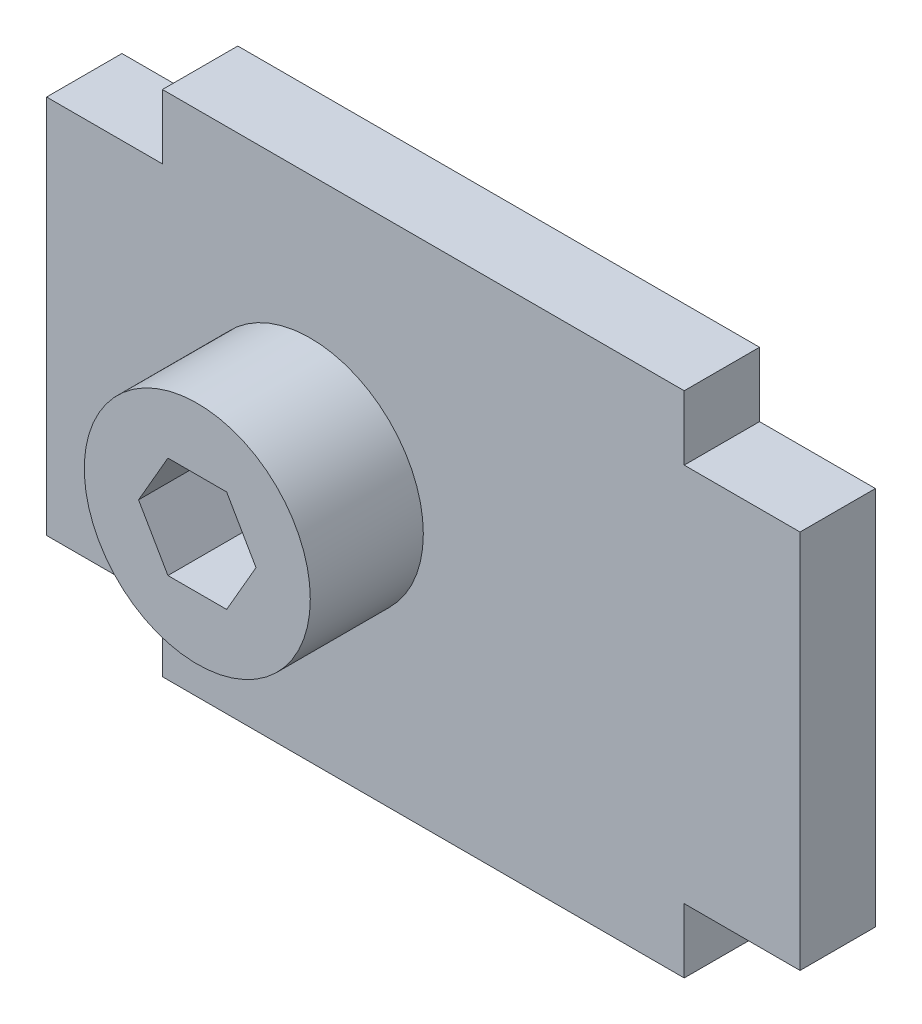
ISO-10303-21;
HEADER;
FILE_DESCRIPTION(('STEP AP214'),'2;1');
FILE_NAME('part.step','',(''),(''),'','','');
FILE_SCHEMA(('AUTOMOTIVE_DESIGN { 1 0 10303 214 1 1 1 1 }'));
ENDSEC;
DATA;
#1=APPLICATION_CONTEXT('core data for automotive mechanical design processes');
#2=APPLICATION_PROTOCOL_DEFINITION('international standard','automotive_design',2000,#1);
#3=PRODUCT_CONTEXT('',#1,'mechanical');
#4=PRODUCT('Part','Part','',(#3));
#5=PRODUCT_RELATED_PRODUCT_CATEGORY('part','',(#4));
#6=PRODUCT_DEFINITION_FORMATION('','',#4);
#7=PRODUCT_DEFINITION_CONTEXT('part definition',#1,'design');
#8=PRODUCT_DEFINITION('design','',#6,#7);
#9=PRODUCT_DEFINITION_SHAPE('','',#8);
#10=(LENGTH_UNIT() NAMED_UNIT(*) SI_UNIT(.MILLI.,.METRE.));
#11=(NAMED_UNIT(*) PLANE_ANGLE_UNIT() SI_UNIT($,.RADIAN.));
#12=(NAMED_UNIT(*) SI_UNIT($,.STERADIAN.) SOLID_ANGLE_UNIT());
#13=UNCERTAINTY_MEASURE_WITH_UNIT(LENGTH_MEASURE(1.E-05),#10,'distance_accuracy_value','');
#14=(GEOMETRIC_REPRESENTATION_CONTEXT(3) GLOBAL_UNCERTAINTY_ASSIGNED_CONTEXT((#13)) GLOBAL_UNIT_ASSIGNED_CONTEXT((#10,
#11,#12)) REPRESENTATION_CONTEXT('',''));
#15=CARTESIAN_POINT('',(0.,0.,0.));
#16=DIRECTION('',(0.,0.,1.));
#17=DIRECTION('',(1.,0.,0.));
#18=AXIS2_PLACEMENT_3D('',#15,#16,#17);
#19=CARTESIAN_POINT('',(0.,0.,4.));
#20=DIRECTION('',(0.,0.,1.));
#21=DIRECTION('',(1.,0.,0.));
#22=AXIS2_PLACEMENT_3D('',#19,#20,#21);
#23=PLANE('',#22);
#24=CARTESIAN_POINT('',(32.4130973656436,-20.4285217908088,4.));
#25=DIRECTION('',(0.,0.,1.));
#26=DIRECTION('',(1.,0.,0.));
#27=AXIS2_PLACEMENT_3D('',#24,#25,#26);
#28=CIRCLE('',#27,1.6);
#29=CARTESIAN_POINT('',(34.0130973656436,-20.4285217908088,4.));
#30=VERTEX_POINT('',#29);
#31=EDGE_CURVE('E170',#30,#30,#28,.T.);
#32=ORIENTED_EDGE('',*,*,#31,.F.);
#33=EDGE_LOOP('',(#32));
#34=FACE_BOUND('',#33,.T.);
#35=DIRECTION('',(0.5,0.866025403784438,0.));
#36=VECTOR('',#35,1.);
#37=CARTESIAN_POINT('',(35.4939010307529,-20.4924133146951,4.));
#38=LINE('',#37,#36);
#39=CARTESIAN_POINT('',(33.9719430924556,-23.1285217908088,4.));
#40=VERTEX_POINT('',#39);
#41=CARTESIAN_POINT('',(35.5307888192676,-20.4285217908088,4.));
#42=VERTEX_POINT('',#41);
#43=EDGE_CURVE('E167',#40,#42,#38,.T.);
#44=ORIENTED_EDGE('',*,*,#43,.T.);
#45=DIRECTION('',(-0.499999999999999,0.866025403784439,0.));
#46=VECTOR('',#45,1.);
#47=CARTESIAN_POINT('',(17.8022821981485,10.2781524192907,4.));
#48=LINE('',#47,#46);
#49=CARTESIAN_POINT('',(33.9719430924556,-17.7285217908088,4.));
#50=VERTEX_POINT('',#49);
#51=EDGE_CURVE('E208',#42,#50,#48,.T.);
#52=ORIENTED_EDGE('',*,*,#51,.T.);
#53=DIRECTION('',(-1.,0.,0.));
#54=VECTOR('',#53,1.);
#55=CARTESIAN_POINT('',(0.,-17.7285217908088,4.));
#56=LINE('',#55,#54);
#57=CARTESIAN_POINT('',(30.8542516388316,-17.7285217908088,4.));
#58=VERTEX_POINT('',#57);
#59=EDGE_CURVE('E206',#50,#58,#56,.T.);
#60=ORIENTED_EDGE('',*,*,#59,.T.);
#61=DIRECTION('',(-0.499999999999999,-0.866025403784439,0.));
#62=VECTOR('',#61,1.);
#63=CARTESIAN_POINT('',(30.8173638503169,-17.7924133146951,4.));
#64=LINE('',#63,#62);
#65=CARTESIAN_POINT('',(29.2954059120196,-20.4285217908088,4.));
#66=VERTEX_POINT('',#65);
#67=EDGE_CURVE('E204',#58,#66,#64,.T.);
#68=ORIENTED_EDGE('',*,*,#67,.T.);
#69=DIRECTION('',(0.5,-0.866025403784439,0.));
#70=VECTOR('',#69,1.);
#71=CARTESIAN_POINT('',(13.1257450177125,7.57815241929071,4.));
#72=LINE('',#71,#70);
#73=CARTESIAN_POINT('',(30.8542516388316,-23.1285217908088,4.));
#74=VERTEX_POINT('',#73);
#75=EDGE_CURVE('E57',#66,#74,#72,.T.);
#76=ORIENTED_EDGE('',*,*,#75,.T.);
#77=DIRECTION('',(1.,0.,0.));
#78=VECTOR('',#77,1.);
#79=CARTESIAN_POINT('',(0.,-23.1285217908088,4.));
#80=LINE('',#79,#78);
#81=EDGE_CURVE('E52',#74,#40,#80,.T.);
#82=ORIENTED_EDGE('',*,*,#81,.T.);
#83=EDGE_LOOP('',(#44,#52,#60,#68,#76,#82));
#84=FACE_BOUND('',#83,.T.);
#85=ADVANCED_FACE('F37',(#34,#84),#23,.T.);
#86=CARTESIAN_POINT('',(52.2630973656438,-6.92852179080886,4.));
#87=DIRECTION('',(0.,-1.,0.));
#88=DIRECTION('',(1.,0.,0.));
#89=AXIS2_PLACEMENT_3D('',#86,#87,#88);
#90=PLANE('',#89);
#91=DIRECTION('',(-1.,0.,0.));
#92=VECTOR('',#91,1.);
#93=CARTESIAN_POINT('',(52.2630973656438,-6.92852179080886,0.));
#94=LINE('',#93,#92);
#95=CARTESIAN_POINT('',(52.2630973656438,-6.92852179080886,0.));
#96=VERTEX_POINT('',#95);
#97=CARTESIAN_POINT('',(24.5630973656438,-6.92852179080886,0.));
#98=VERTEX_POINT('',#97);
#99=EDGE_CURVE('E226',#96,#98,#94,.T.);
#100=ORIENTED_EDGE('',*,*,#99,.T.);
#101=DIRECTION('',(0.,0.,-1.));
#102=VECTOR('',#101,1.);
#103=CARTESIAN_POINT('',(24.5630973656438,-6.92852179080886,4.));
#104=LINE('',#103,#102);
#105=CARTESIAN_POINT('',(24.5630973656438,-6.92852179080886,4.));
#106=VERTEX_POINT('',#105);
#107=EDGE_CURVE('E11',#106,#98,#104,.T.);
#108=ORIENTED_EDGE('',*,*,#107,.F.);
#109=DIRECTION('',(-1.,0.,0.));
#110=VECTOR('',#109,1.);
#111=CARTESIAN_POINT('',(52.2630973656438,-6.92852179080886,4.));
#112=LINE('',#111,#110);
#113=CARTESIAN_POINT('',(52.2630973656438,-6.92852179080886,4.));
#114=VERTEX_POINT('',#113);
#115=EDGE_CURVE('E229',#114,#106,#112,.T.);
#116=ORIENTED_EDGE('',*,*,#115,.F.);
#117=DIRECTION('',(0.,0.,-1.));
#118=VECTOR('',#117,1.);
#119=CARTESIAN_POINT('',(52.2630973656438,-6.92852179080886,4.));
#120=LINE('',#119,#118);
#121=EDGE_CURVE('E255',#114,#96,#120,.T.);
#122=ORIENTED_EDGE('',*,*,#121,.T.);
#123=EDGE_LOOP('',(#100,#108,#116,#122));
#124=FACE_BOUND('',#123,.T.);
#125=ADVANCED_FACE('F39',(#124),#90,.F.);
#126=CARTESIAN_POINT('',(24.5630973656438,-6.92852179080886,4.));
#127=DIRECTION('',(1.,0.,0.));
#128=DIRECTION('',(0.,0.,-1.));
#129=AXIS2_PLACEMENT_3D('',#126,#127,#128);
#130=PLANE('',#129);
#131=DIRECTION('',(0.,-1.,0.));
#132=VECTOR('',#131,1.);
#133=CARTESIAN_POINT('',(24.5630973656438,-6.92852179080886,0.));
#134=LINE('',#133,#132);
#135=CARTESIAN_POINT('',(24.5630973656438,-10.3485217908088,0.));
#136=VERTEX_POINT('',#135);
#137=EDGE_CURVE('E258',#98,#136,#134,.T.);
#138=ORIENTED_EDGE('',*,*,#137,.T.);
#139=DIRECTION('',(0.,0.,-1.));
#140=VECTOR('',#139,1.);
#141=CARTESIAN_POINT('',(24.5630973656438,-10.3485217908088,4.));
#142=LINE('',#141,#140);
#143=CARTESIAN_POINT('',(24.5630973656438,-10.3485217908088,4.));
#144=VERTEX_POINT('',#143);
#145=EDGE_CURVE('E45',#144,#136,#142,.T.);
#146=ORIENTED_EDGE('',*,*,#145,.F.);
#147=DIRECTION('',(0.,-1.,0.));
#148=VECTOR('',#147,1.);
#149=CARTESIAN_POINT('',(24.5630973656438,-6.92852179080886,4.));
#150=LINE('',#149,#148);
#151=EDGE_CURVE('E232',#106,#144,#150,.T.);
#152=ORIENTED_EDGE('',*,*,#151,.F.);
#153=ORIENTED_EDGE('',*,*,#107,.T.);
#154=EDGE_LOOP('',(#138,#146,#152,#153));
#155=FACE_BOUND('',#154,.T.);
#156=ADVANCED_FACE('F335',(#155),#130,.F.);
#157=CARTESIAN_POINT('',(24.5630973656438,-10.3485217908088,4.));
#158=DIRECTION('',(0.,-1.,0.));
#159=DIRECTION('',(1.,0.,0.));
#160=AXIS2_PLACEMENT_3D('',#157,#158,#159);
#161=PLANE('',#160);
#162=DIRECTION('',(-1.,0.,0.));
#163=VECTOR('',#162,1.);
#164=CARTESIAN_POINT('',(24.5630973656438,-10.3485217908088,0.));
#165=LINE('',#164,#163);
#166=CARTESIAN_POINT('',(18.4130973656438,-10.3485217908088,0.));
#167=VERTEX_POINT('',#166);
#168=EDGE_CURVE('E260',#136,#167,#165,.T.);
#169=ORIENTED_EDGE('',*,*,#168,.T.);
#170=DIRECTION('',(0.,0.,-1.));
#171=VECTOR('',#170,1.);
#172=CARTESIAN_POINT('',(18.4130973656438,-10.3485217908088,4.));
#173=LINE('',#172,#171);
#174=CARTESIAN_POINT('',(18.4130973656438,-10.3485217908088,4.));
#175=VERTEX_POINT('',#174);
#176=EDGE_CURVE('E305',#175,#167,#173,.T.);
#177=ORIENTED_EDGE('',*,*,#176,.F.);
#178=DIRECTION('',(-1.,0.,0.));
#179=VECTOR('',#178,1.);
#180=CARTESIAN_POINT('',(24.5630973656438,-10.3485217908088,4.));
#181=LINE('',#180,#179);
#182=EDGE_CURVE('E235',#144,#175,#181,.T.);
#183=ORIENTED_EDGE('',*,*,#182,.F.);
#184=ORIENTED_EDGE('',*,*,#145,.T.);
#185=EDGE_LOOP('',(#169,#177,#183,#184));
#186=FACE_BOUND('',#185,.T.);
#187=ADVANCED_FACE('F312',(#186),#161,.F.);
#188=CARTESIAN_POINT('',(18.4130973656438,-10.3485217908088,4.));
#189=DIRECTION('',(1.,0.,0.));
#190=DIRECTION('',(0.,1.,0.));
#191=AXIS2_PLACEMENT_3D('',#188,#189,#190);
#192=PLANE('',#191);
#193=DIRECTION('',(0.,-1.,0.));
#194=VECTOR('',#193,1.);
#195=CARTESIAN_POINT('',(18.4130973656438,-10.3485217908088,0.));
#196=LINE('',#195,#194);
#197=CARTESIAN_POINT('',(18.4130973656438,-30.5085217908088,0.));
#198=VERTEX_POINT('',#197);
#199=EDGE_CURVE('E262',#167,#198,#196,.T.);
#200=ORIENTED_EDGE('',*,*,#199,.T.);
#201=DIRECTION('',(0.,0.,-1.));
#202=VECTOR('',#201,1.);
#203=CARTESIAN_POINT('',(18.4130973656438,-30.5085217908088,4.));
#204=LINE('',#203,#202);
#205=CARTESIAN_POINT('',(18.4130973656438,-30.5085217908088,4.));
#206=VERTEX_POINT('',#205);
#207=EDGE_CURVE('E302',#206,#198,#204,.T.);
#208=ORIENTED_EDGE('',*,*,#207,.F.);
#209=DIRECTION('',(0.,-1.,0.));
#210=VECTOR('',#209,1.);
#211=CARTESIAN_POINT('',(18.4130973656438,-10.3485217908088,4.));
#212=LINE('',#211,#210);
#213=EDGE_CURVE('E237',#175,#206,#212,.T.);
#214=ORIENTED_EDGE('',*,*,#213,.F.);
#215=ORIENTED_EDGE('',*,*,#176,.T.);
#216=EDGE_LOOP('',(#200,#208,#214,#215));
#217=FACE_BOUND('',#216,.T.);
#218=ADVANCED_FACE('F323',(#217),#192,.F.);
#219=CARTESIAN_POINT('',(18.4130973656438,-30.5085217908088,4.));
#220=DIRECTION('',(0.,1.,0.));
#221=DIRECTION('',(0.,0.,1.));
#222=AXIS2_PLACEMENT_3D('',#219,#220,#221);
#223=PLANE('',#222);
#224=DIRECTION('',(1.,0.,0.));
#225=VECTOR('',#224,1.);
#226=CARTESIAN_POINT('',(18.4130973656438,-30.5085217908088,0.));
#227=LINE('',#226,#225);
#228=CARTESIAN_POINT('',(24.5630973656438,-30.5085217908088,0.));
#229=VERTEX_POINT('',#228);
#230=EDGE_CURVE('E264',#198,#229,#227,.T.);
#231=ORIENTED_EDGE('',*,*,#230,.T.);
#232=DIRECTION('',(0.,0.,-1.));
#233=VECTOR('',#232,1.);
#234=CARTESIAN_POINT('',(24.5630973656438,-30.5085217908088,4.));
#235=LINE('',#234,#233);
#236=CARTESIAN_POINT('',(24.5630973656438,-30.5085217908088,4.));
#237=VERTEX_POINT('',#236);
#238=EDGE_CURVE('E299',#237,#229,#235,.T.);
#239=ORIENTED_EDGE('',*,*,#238,.F.);
#240=DIRECTION('',(1.,0.,0.));
#241=VECTOR('',#240,1.);
#242=CARTESIAN_POINT('',(18.4130973656438,-30.5085217908088,4.));
#243=LINE('',#242,#241);
#244=EDGE_CURVE('E239',#206,#237,#243,.T.);
#245=ORIENTED_EDGE('',*,*,#244,.F.);
#246=ORIENTED_EDGE('',*,*,#207,.T.);
#247=EDGE_LOOP('',(#231,#239,#245,#246));
#248=FACE_BOUND('',#247,.T.);
#249=ADVANCED_FACE('F327',(#248),#223,.F.);
#250=CARTESIAN_POINT('',(24.5630973656438,-30.5085217908088,4.));
#251=DIRECTION('',(1.,0.,0.));
#252=DIRECTION('',(0.,0.,-1.));
#253=AXIS2_PLACEMENT_3D('',#250,#251,#252);
#254=PLANE('',#253);
#255=DIRECTION('',(0.,-1.,0.));
#256=VECTOR('',#255,1.);
#257=CARTESIAN_POINT('',(24.5630973656438,-30.5085217908088,0.));
#258=LINE('',#257,#256);
#259=CARTESIAN_POINT('',(24.5630973656438,-33.9285217908089,0.));
#260=VERTEX_POINT('',#259);
#261=EDGE_CURVE('E266',#229,#260,#258,.T.);
#262=ORIENTED_EDGE('',*,*,#261,.T.);
#263=DIRECTION('',(0.,0.,-1.));
#264=VECTOR('',#263,1.);
#265=CARTESIAN_POINT('',(24.5630973656438,-33.9285217908089,4.));
#266=LINE('',#265,#264);
#267=CARTESIAN_POINT('',(24.5630973656438,-33.9285217908089,4.));
#268=VERTEX_POINT('',#267);
#269=EDGE_CURVE('E296',#268,#260,#266,.T.);
#270=ORIENTED_EDGE('',*,*,#269,.F.);
#271=DIRECTION('',(0.,-1.,0.));
#272=VECTOR('',#271,1.);
#273=CARTESIAN_POINT('',(24.5630973656438,-30.5085217908088,4.));
#274=LINE('',#273,#272);
#275=EDGE_CURVE('E241',#237,#268,#274,.T.);
#276=ORIENTED_EDGE('',*,*,#275,.F.);
#277=ORIENTED_EDGE('',*,*,#238,.T.);
#278=EDGE_LOOP('',(#262,#270,#276,#277));
#279=FACE_BOUND('',#278,.T.);
#280=ADVANCED_FACE('F368',(#279),#254,.F.);
#281=CARTESIAN_POINT('',(24.5630973656438,-33.9285217908089,4.));
#282=DIRECTION('',(0.,1.,0.));
#283=DIRECTION('',(0.,0.,1.));
#284=AXIS2_PLACEMENT_3D('',#281,#282,#283);
#285=PLANE('',#284);
#286=DIRECTION('',(1.,0.,0.));
#287=VECTOR('',#286,1.);
#288=CARTESIAN_POINT('',(24.5630973656438,-33.9285217908089,0.));
#289=LINE('',#288,#287);
#290=CARTESIAN_POINT('',(52.2630973656439,-33.9285217908089,0.));
#291=VERTEX_POINT('',#290);
#292=EDGE_CURVE('E268',#260,#291,#289,.T.);
#293=ORIENTED_EDGE('',*,*,#292,.T.);
#294=DIRECTION('',(0.,0.,-1.));
#295=VECTOR('',#294,1.);
#296=CARTESIAN_POINT('',(52.2630973656439,-33.9285217908089,4.));
#297=LINE('',#296,#295);
#298=CARTESIAN_POINT('',(52.2630973656439,-33.9285217908089,4.));
#299=VERTEX_POINT('',#298);
#300=EDGE_CURVE('E293',#299,#291,#297,.T.);
#301=ORIENTED_EDGE('',*,*,#300,.F.);
#302=DIRECTION('',(1.,0.,0.));
#303=VECTOR('',#302,1.);
#304=CARTESIAN_POINT('',(24.5630973656438,-33.9285217908089,4.));
#305=LINE('',#304,#303);
#306=EDGE_CURVE('E243',#268,#299,#305,.T.);
#307=ORIENTED_EDGE('',*,*,#306,.F.);
#308=ORIENTED_EDGE('',*,*,#269,.T.);
#309=EDGE_LOOP('',(#293,#301,#307,#308));
#310=FACE_BOUND('',#309,.T.);
#311=ADVANCED_FACE('F366',(#310),#285,.F.);
#312=CARTESIAN_POINT('',(52.2630973656439,-33.9285217908089,4.));
#313=DIRECTION('',(-1.,0.,0.));
#314=DIRECTION('',(0.,-1.,0.));
#315=AXIS2_PLACEMENT_3D('',#312,#313,#314);
#316=PLANE('',#315);
#317=DIRECTION('',(0.,1.,0.));
#318=VECTOR('',#317,1.);
#319=CARTESIAN_POINT('',(52.2630973656439,-33.9285217908089,0.));
#320=LINE('',#319,#318);
#321=CARTESIAN_POINT('',(52.2630973656438,-30.5085217908088,0.));
#322=VERTEX_POINT('',#321);
#323=EDGE_CURVE('E270',#291,#322,#320,.T.);
#324=ORIENTED_EDGE('',*,*,#323,.T.);
#325=DIRECTION('',(0.,0.,-1.));
#326=VECTOR('',#325,1.);
#327=CARTESIAN_POINT('',(52.2630973656438,-30.5085217908088,4.));
#328=LINE('',#327,#326);
#329=CARTESIAN_POINT('',(52.2630973656438,-30.5085217908088,4.));
#330=VERTEX_POINT('',#329);
#331=EDGE_CURVE('E290',#330,#322,#328,.T.);
#332=ORIENTED_EDGE('',*,*,#331,.F.);
#333=DIRECTION('',(0.,1.,0.));
#334=VECTOR('',#333,1.);
#335=CARTESIAN_POINT('',(52.2630973656439,-33.9285217908089,4.));
#336=LINE('',#335,#334);
#337=EDGE_CURVE('E245',#299,#330,#336,.T.);
#338=ORIENTED_EDGE('',*,*,#337,.F.);
#339=ORIENTED_EDGE('',*,*,#300,.T.);
#340=EDGE_LOOP('',(#324,#332,#338,#339));
#341=FACE_BOUND('',#340,.T.);
#342=ADVANCED_FACE('F362',(#341),#316,.F.);
#343=CARTESIAN_POINT('',(52.2630973656438,-30.5085217908088,4.));
#344=DIRECTION('',(0.,1.,0.));
#345=DIRECTION('',(-1.,0.,0.));
#346=AXIS2_PLACEMENT_3D('',#343,#344,#345);
#347=PLANE('',#346);
#348=DIRECTION('',(1.,0.,0.));
#349=VECTOR('',#348,1.);
#350=CARTESIAN_POINT('',(52.2630973656438,-30.5085217908088,0.));
#351=LINE('',#350,#349);
#352=CARTESIAN_POINT('',(58.4130973656438,-30.5085217908088,0.));
#353=VERTEX_POINT('',#352);
#354=EDGE_CURVE('E272',#322,#353,#351,.T.);
#355=ORIENTED_EDGE('',*,*,#354,.T.);
#356=DIRECTION('',(0.,0.,-1.));
#357=VECTOR('',#356,1.);
#358=CARTESIAN_POINT('',(58.4130973656438,-30.5085217908088,4.));
#359=LINE('',#358,#357);
#360=CARTESIAN_POINT('',(58.4130973656438,-30.5085217908088,4.));
#361=VERTEX_POINT('',#360);
#362=EDGE_CURVE('E287',#361,#353,#359,.T.);
#363=ORIENTED_EDGE('',*,*,#362,.F.);
#364=DIRECTION('',(1.,0.,0.));
#365=VECTOR('',#364,1.);
#366=CARTESIAN_POINT('',(52.2630973656438,-30.5085217908088,4.));
#367=LINE('',#366,#365);
#368=EDGE_CURVE('E247',#330,#361,#367,.T.);
#369=ORIENTED_EDGE('',*,*,#368,.F.);
#370=ORIENTED_EDGE('',*,*,#331,.T.);
#371=EDGE_LOOP('',(#355,#363,#369,#370));
#372=FACE_BOUND('',#371,.T.);
#373=ADVANCED_FACE('F357',(#372),#347,.F.);
#374=CARTESIAN_POINT('',(58.4130973656438,-30.5085217908088,4.));
#375=DIRECTION('',(-1.,0.,0.));
#376=DIRECTION('',(0.,0.,1.));
#377=AXIS2_PLACEMENT_3D('',#374,#375,#376);
#378=PLANE('',#377);
#379=DIRECTION('',(0.,1.,0.));
#380=VECTOR('',#379,1.);
#381=CARTESIAN_POINT('',(58.4130973656438,-30.5085217908088,0.));
#382=LINE('',#381,#380);
#383=CARTESIAN_POINT('',(58.4130973656438,-10.3485217908088,0.));
#384=VERTEX_POINT('',#383);
#385=EDGE_CURVE('E274',#353,#384,#382,.T.);
#386=ORIENTED_EDGE('',*,*,#385,.T.);
#387=DIRECTION('',(0.,0.,-1.));
#388=VECTOR('',#387,1.);
#389=CARTESIAN_POINT('',(58.4130973656438,-10.3485217908088,4.));
#390=LINE('',#389,#388);
#391=CARTESIAN_POINT('',(58.4130973656438,-10.3485217908088,4.));
#392=VERTEX_POINT('',#391);
#393=EDGE_CURVE('E284',#392,#384,#390,.T.);
#394=ORIENTED_EDGE('',*,*,#393,.F.);
#395=DIRECTION('',(0.,1.,0.));
#396=VECTOR('',#395,1.);
#397=CARTESIAN_POINT('',(58.4130973656438,-30.5085217908088,4.));
#398=LINE('',#397,#396);
#399=EDGE_CURVE('E249',#361,#392,#398,.T.);
#400=ORIENTED_EDGE('',*,*,#399,.F.);
#401=ORIENTED_EDGE('',*,*,#362,.T.);
#402=EDGE_LOOP('',(#386,#394,#400,#401));
#403=FACE_BOUND('',#402,.T.);
#404=ADVANCED_FACE('F351',(#403),#378,.F.);
#405=CARTESIAN_POINT('',(58.4130973656438,-10.3485217908088,4.));
#406=DIRECTION('',(0.,-1.,0.));
#407=DIRECTION('',(0.,0.,-1.));
#408=AXIS2_PLACEMENT_3D('',#405,#406,#407);
#409=PLANE('',#408);
#410=DIRECTION('',(-1.,0.,0.));
#411=VECTOR('',#410,1.);
#412=CARTESIAN_POINT('',(58.4130973656438,-10.3485217908088,0.));
#413=LINE('',#412,#411);
#414=CARTESIAN_POINT('',(52.2630973656438,-10.3485217908088,0.));
#415=VERTEX_POINT('',#414);
#416=EDGE_CURVE('E276',#384,#415,#413,.T.);
#417=ORIENTED_EDGE('',*,*,#416,.T.);
#418=DIRECTION('',(0.,0.,-1.));
#419=VECTOR('',#418,1.);
#420=CARTESIAN_POINT('',(52.2630973656438,-10.3485217908088,4.));
#421=LINE('',#420,#419);
#422=CARTESIAN_POINT('',(52.2630973656438,-10.3485217908088,4.));
#423=VERTEX_POINT('',#422);
#424=EDGE_CURVE('E281',#423,#415,#421,.T.);
#425=ORIENTED_EDGE('',*,*,#424,.F.);
#426=DIRECTION('',(-1.,0.,0.));
#427=VECTOR('',#426,1.);
#428=CARTESIAN_POINT('',(58.4130973656438,-10.3485217908088,4.));
#429=LINE('',#428,#427);
#430=EDGE_CURVE('E251',#392,#423,#429,.T.);
#431=ORIENTED_EDGE('',*,*,#430,.F.);
#432=ORIENTED_EDGE('',*,*,#393,.T.);
#433=EDGE_LOOP('',(#417,#425,#431,#432));
#434=FACE_BOUND('',#433,.T.);
#435=ADVANCED_FACE('F347',(#434),#409,.F.);
#436=CARTESIAN_POINT('',(52.2630973656438,-10.3485217908088,4.));
#437=DIRECTION('',(-1.,0.,0.));
#438=DIRECTION('',(0.,0.,1.));
#439=AXIS2_PLACEMENT_3D('',#436,#437,#438);
#440=PLANE('',#439);
#441=DIRECTION('',(0.,1.,0.));
#442=VECTOR('',#441,1.);
#443=CARTESIAN_POINT('',(52.2630973656438,-10.3485217908088,0.));
#444=LINE('',#443,#442);
#445=EDGE_CURVE('E233',#415,#96,#444,.T.);
#446=ORIENTED_EDGE('',*,*,#445,.T.);
#447=ORIENTED_EDGE('',*,*,#121,.F.);
#448=DIRECTION('',(0.,1.,0.));
#449=VECTOR('',#448,1.);
#450=CARTESIAN_POINT('',(52.2630973656438,-10.3485217908088,4.));
#451=LINE('',#450,#449);
#452=EDGE_CURVE('E253',#423,#114,#451,.T.);
#453=ORIENTED_EDGE('',*,*,#452,.F.);
#454=ORIENTED_EDGE('',*,*,#424,.T.);
#455=EDGE_LOOP('',(#446,#447,#453,#454));
#456=FACE_BOUND('',#455,.T.);
#457=ADVANCED_FACE('F342',(#456),#440,.F.);
#458=CARTESIAN_POINT('',(32.4130973656436,-20.4285217908088,4.));
#459=DIRECTION('',(0.,0.,1.));
#460=DIRECTION('',(1.,0.,0.));
#461=AXIS2_PLACEMENT_3D('',#458,#459,#460);
#462=CIRCLE('',#461,6.);
#463=CARTESIAN_POINT('',(38.4130973656436,-20.4285217908088,4.));
#464=VERTEX_POINT('',#463);
#465=EDGE_CURVE('E183',#464,#464,#462,.T.);
#466=ORIENTED_EDGE('',*,*,#465,.F.);
#467=EDGE_LOOP('',(#466));
#468=FACE_BOUND('',#467,.T.);
#469=ORIENTED_EDGE('',*,*,#115,.T.);
#470=ORIENTED_EDGE('',*,*,#151,.T.);
#471=ORIENTED_EDGE('',*,*,#182,.T.);
#472=ORIENTED_EDGE('',*,*,#213,.T.);
#473=ORIENTED_EDGE('',*,*,#244,.T.);
#474=ORIENTED_EDGE('',*,*,#275,.T.);
#475=ORIENTED_EDGE('',*,*,#306,.T.);
#476=ORIENTED_EDGE('',*,*,#337,.T.);
#477=ORIENTED_EDGE('',*,*,#368,.T.);
#478=ORIENTED_EDGE('',*,*,#399,.T.);
#479=ORIENTED_EDGE('',*,*,#430,.T.);
#480=ORIENTED_EDGE('',*,*,#452,.T.);
#481=EDGE_LOOP('',(#469,#470,#471,#472,#473,#474,#475,#476,#477,#478,#479,#480));
#482=FACE_BOUND('',#481,.T.);
#483=ADVANCED_FACE('F331',(#468,#482),#23,.T.);
#484=CARTESIAN_POINT('',(0.,0.,0.));
#485=DIRECTION('',(0.,0.,1.));
#486=DIRECTION('',(1.,0.,0.));
#487=AXIS2_PLACEMENT_3D('',#484,#485,#486);
#488=PLANE('',#487);
#489=CARTESIAN_POINT('',(32.4130973656436,-20.4285217908088,0.));
#490=DIRECTION('',(0.,0.,1.));
#491=DIRECTION('',(1.,0.,0.));
#492=AXIS2_PLACEMENT_3D('',#489,#490,#491);
#493=CIRCLE('',#492,1.6);
#494=CARTESIAN_POINT('',(34.0130973656436,-20.4285217908088,0.));
#495=VERTEX_POINT('',#494);
#496=EDGE_CURVE('E223',#495,#495,#493,.T.);
#497=ORIENTED_EDGE('',*,*,#496,.T.);
#498=EDGE_LOOP('',(#497));
#499=FACE_BOUND('',#498,.T.);
#500=ORIENTED_EDGE('',*,*,#99,.F.);
#501=ORIENTED_EDGE('',*,*,#445,.F.);
#502=ORIENTED_EDGE('',*,*,#416,.F.);
#503=ORIENTED_EDGE('',*,*,#385,.F.);
#504=ORIENTED_EDGE('',*,*,#354,.F.);
#505=ORIENTED_EDGE('',*,*,#323,.F.);
#506=ORIENTED_EDGE('',*,*,#292,.F.);
#507=ORIENTED_EDGE('',*,*,#261,.F.);
#508=ORIENTED_EDGE('',*,*,#230,.F.);
#509=ORIENTED_EDGE('',*,*,#199,.F.);
#510=ORIENTED_EDGE('',*,*,#168,.F.);
#511=ORIENTED_EDGE('',*,*,#137,.F.);
#512=EDGE_LOOP('',(#500,#501,#502,#503,#504,#505,#506,#507,#508,#509,#510,#511));
#513=FACE_BOUND('',#512,.T.);
#514=ADVANCED_FACE('F318',(#499,#513),#488,.F.);
#515=CARTESIAN_POINT('',(32.4130973656436,-20.4285217908088,0.));
#516=DIRECTION('',(0.,0.,1.));
#517=DIRECTION('',(1.,0.,0.));
#518=AXIS2_PLACEMENT_3D('',#515,#516,#517);
#519=CYLINDRICAL_SURFACE('',#518,1.6);
#520=ORIENTED_EDGE('',*,*,#496,.F.);
#521=EDGE_LOOP('',(#520));
#522=FACE_BOUND('',#521,.T.);
#523=ORIENTED_EDGE('',*,*,#31,.T.);
#524=EDGE_LOOP('',(#523));
#525=FACE_BOUND('',#524,.T.);
#526=ADVANCED_FACE('F393',(#522,#525),#519,.F.);
#527=CARTESIAN_POINT('',(35.4939010307529,-20.4924133146951,10.));
#528=DIRECTION('',(-0.866025403784438,0.5,0.));
#529=DIRECTION('',(-0.5,-0.866025403784439,0.));
#530=AXIS2_PLACEMENT_3D('',#527,#528,#529);
#531=PLANE('',#530);
#532=ORIENTED_EDGE('',*,*,#43,.F.);
#533=DIRECTION('',(0.,0.,-1.));
#534=VECTOR('',#533,1.);
#535=CARTESIAN_POINT('',(33.9719430924556,-23.1285217908088,10.));
#536=LINE('',#535,#534);
#537=CARTESIAN_POINT('',(33.9719430924556,-23.1285217908088,10.));
#538=VERTEX_POINT('',#537);
#539=EDGE_CURVE('E161',#538,#40,#536,.T.);
#540=ORIENTED_EDGE('',*,*,#539,.F.);
#541=DIRECTION('',(0.5,0.866025403784438,0.));
#542=VECTOR('',#541,1.);
#543=CARTESIAN_POINT('',(35.4939010307529,-20.4924133146951,10.));
#544=LINE('',#543,#542);
#545=CARTESIAN_POINT('',(35.5307888192676,-20.4285217908088,10.));
#546=VERTEX_POINT('',#545);
#547=EDGE_CURVE('E165',#538,#546,#544,.T.);
#548=ORIENTED_EDGE('',*,*,#547,.T.);
#549=DIRECTION('',(0.,0.,-1.));
#550=VECTOR('',#549,1.);
#551=CARTESIAN_POINT('',(35.5307888192676,-20.4285217908088,10.));
#552=LINE('',#551,#550);
#553=EDGE_CURVE('E200',#546,#42,#552,.T.);
#554=ORIENTED_EDGE('',*,*,#553,.T.);
#555=EDGE_LOOP('',(#532,#540,#548,#554));
#556=FACE_BOUND('',#555,.T.);
#557=ADVANCED_FACE('F163',(#556),#531,.T.);
#558=CARTESIAN_POINT('',(0.,-23.1285217908088,10.));
#559=DIRECTION('',(0.,1.,0.));
#560=DIRECTION('',(0.,0.,1.));
#561=AXIS2_PLACEMENT_3D('',#558,#559,#560);
#562=PLANE('',#561);
#563=ORIENTED_EDGE('',*,*,#81,.F.);
#564=DIRECTION('',(0.,0.,-1.));
#565=VECTOR('',#564,1.);
#566=CARTESIAN_POINT('',(30.8542516388316,-23.1285217908088,10.));
#567=LINE('',#566,#565);
#568=CARTESIAN_POINT('',(30.8542516388316,-23.1285217908088,10.));
#569=VERTEX_POINT('',#568);
#570=EDGE_CURVE('E171',#569,#74,#567,.T.);
#571=ORIENTED_EDGE('',*,*,#570,.F.);
#572=DIRECTION('',(1.,0.,0.));
#573=VECTOR('',#572,1.);
#574=CARTESIAN_POINT('',(0.,-23.1285217908088,10.));
#575=LINE('',#574,#573);
#576=EDGE_CURVE('E178',#569,#538,#575,.T.);
#577=ORIENTED_EDGE('',*,*,#576,.T.);
#578=ORIENTED_EDGE('',*,*,#539,.T.);
#579=EDGE_LOOP('',(#563,#571,#577,#578));
#580=FACE_BOUND('',#579,.T.);
#581=ADVANCED_FACE('F185',(#580),#562,.T.);
#582=CARTESIAN_POINT('',(13.1257450177125,7.57815241929071,10.));
#583=DIRECTION('',(0.866025403784439,0.5,0.));
#584=DIRECTION('',(-0.5,0.866025403784439,0.));
#585=AXIS2_PLACEMENT_3D('',#582,#583,#584);
#586=PLANE('',#585);
#587=ORIENTED_EDGE('',*,*,#75,.F.);
#588=DIRECTION('',(0.,0.,-1.));
#589=VECTOR('',#588,1.);
#590=CARTESIAN_POINT('',(29.2954059120196,-20.4285217908088,10.));
#591=LINE('',#590,#589);
#592=CARTESIAN_POINT('',(29.2954059120196,-20.4285217908088,10.));
#593=VERTEX_POINT('',#592);
#594=EDGE_CURVE('E219',#593,#66,#591,.T.);
#595=ORIENTED_EDGE('',*,*,#594,.F.);
#596=DIRECTION('',(0.5,-0.866025403784439,0.));
#597=VECTOR('',#596,1.);
#598=CARTESIAN_POINT('',(13.1257450177125,7.57815241929071,10.));
#599=LINE('',#598,#597);
#600=EDGE_CURVE('E186',#593,#569,#599,.T.);
#601=ORIENTED_EDGE('',*,*,#600,.T.);
#602=ORIENTED_EDGE('',*,*,#570,.T.);
#603=EDGE_LOOP('',(#587,#595,#601,#602));
#604=FACE_BOUND('',#603,.T.);
#605=ADVANCED_FACE('F420',(#604),#586,.T.);
#606=CARTESIAN_POINT('',(30.8173638503169,-17.7924133146951,10.));
#607=DIRECTION('',(0.866025403784439,-0.499999999999999,0.));
#608=DIRECTION('',(0.499999999999999,0.866025403784439,0.));
#609=AXIS2_PLACEMENT_3D('',#606,#607,#608);
#610=PLANE('',#609);
#611=ORIENTED_EDGE('',*,*,#67,.F.);
#612=DIRECTION('',(0.,0.,-1.));
#613=VECTOR('',#612,1.);
#614=CARTESIAN_POINT('',(30.8542516388316,-17.7285217908088,10.));
#615=LINE('',#614,#613);
#616=CARTESIAN_POINT('',(30.8542516388316,-17.7285217908088,10.));
#617=VERTEX_POINT('',#616);
#618=EDGE_CURVE('E216',#617,#58,#615,.T.);
#619=ORIENTED_EDGE('',*,*,#618,.F.);
#620=DIRECTION('',(-0.499999999999999,-0.866025403784439,0.));
#621=VECTOR('',#620,1.);
#622=CARTESIAN_POINT('',(30.8173638503169,-17.7924133146951,10.));
#623=LINE('',#622,#621);
#624=EDGE_CURVE('E188',#617,#593,#623,.T.);
#625=ORIENTED_EDGE('',*,*,#624,.T.);
#626=ORIENTED_EDGE('',*,*,#594,.T.);
#627=EDGE_LOOP('',(#611,#619,#625,#626));
#628=FACE_BOUND('',#627,.T.);
#629=ADVANCED_FACE('F416',(#628),#610,.T.);
#630=CARTESIAN_POINT('',(0.,-17.7285217908088,10.));
#631=DIRECTION('',(0.,-1.,0.));
#632=DIRECTION('',(0.,0.,-1.));
#633=AXIS2_PLACEMENT_3D('',#630,#631,#632);
#634=PLANE('',#633);
#635=ORIENTED_EDGE('',*,*,#59,.F.);
#636=DIRECTION('',(0.,0.,-1.));
#637=VECTOR('',#636,1.);
#638=CARTESIAN_POINT('',(33.9719430924556,-17.7285217908088,10.));
#639=LINE('',#638,#637);
#640=CARTESIAN_POINT('',(33.9719430924556,-17.7285217908088,10.));
#641=VERTEX_POINT('',#640);
#642=EDGE_CURVE('E213',#641,#50,#639,.T.);
#643=ORIENTED_EDGE('',*,*,#642,.F.);
#644=DIRECTION('',(-1.,0.,0.));
#645=VECTOR('',#644,1.);
#646=CARTESIAN_POINT('',(0.,-17.7285217908088,10.));
#647=LINE('',#646,#645);
#648=EDGE_CURVE('E193',#641,#617,#647,.T.);
#649=ORIENTED_EDGE('',*,*,#648,.T.);
#650=ORIENTED_EDGE('',*,*,#618,.T.);
#651=EDGE_LOOP('',(#635,#643,#649,#650));
#652=FACE_BOUND('',#651,.T.);
#653=ADVANCED_FACE('F409',(#652),#634,.T.);
#654=CARTESIAN_POINT('',(17.8022821981485,10.2781524192907,10.));
#655=DIRECTION('',(-0.866025403784439,-0.499999999999999,0.));
#656=DIRECTION('',(0.499999999999999,-0.866025403784439,0.));
#657=AXIS2_PLACEMENT_3D('',#654,#655,#656);
#658=PLANE('',#657);
#659=ORIENTED_EDGE('',*,*,#51,.F.);
#660=ORIENTED_EDGE('',*,*,#553,.F.);
#661=DIRECTION('',(-0.499999999999999,0.866025403784439,0.));
#662=VECTOR('',#661,1.);
#663=CARTESIAN_POINT('',(17.8022821981485,10.2781524192907,10.));
#664=LINE('',#663,#662);
#665=EDGE_CURVE('E182',#546,#641,#664,.T.);
#666=ORIENTED_EDGE('',*,*,#665,.T.);
#667=ORIENTED_EDGE('',*,*,#642,.T.);
#668=EDGE_LOOP('',(#659,#660,#666,#667));
#669=FACE_BOUND('',#668,.T.);
#670=ADVANCED_FACE('F401',(#669),#658,.T.);
#671=CARTESIAN_POINT('',(32.4130973656436,-20.4285217908088,10.));
#672=DIRECTION('',(0.,0.,-1.));
#673=DIRECTION('',(-1.,0.,0.));
#674=AXIS2_PLACEMENT_3D('',#671,#672,#673);
#675=CYLINDRICAL_SURFACE('',#674,6.);
#676=CARTESIAN_POINT('',(32.4130973656436,-20.4285217908088,10.));
#677=DIRECTION('',(0.,0.,1.));
#678=DIRECTION('',(1.,0.,0.));
#679=AXIS2_PLACEMENT_3D('',#676,#677,#678);
#680=CIRCLE('',#679,6.);
#681=CARTESIAN_POINT('',(38.4130973656436,-20.4285217908088,10.));
#682=VERTEX_POINT('',#681);
#683=EDGE_CURVE('E197',#682,#682,#680,.T.);
#684=ORIENTED_EDGE('',*,*,#683,.F.);
#685=EDGE_LOOP('',(#684));
#686=FACE_BOUND('',#685,.T.);
#687=ORIENTED_EDGE('',*,*,#465,.T.);
#688=EDGE_LOOP('',(#687));
#689=FACE_BOUND('',#688,.T.);
#690=ADVANCED_FACE('F399',(#686,#689),#675,.T.);
#691=CARTESIAN_POINT('',(0.,0.,10.));
#692=DIRECTION('',(0.,0.,1.));
#693=DIRECTION('',(1.,0.,0.));
#694=AXIS2_PLACEMENT_3D('',#691,#692,#693);
#695=PLANE('',#694);
#696=ORIENTED_EDGE('',*,*,#547,.F.);
#697=ORIENTED_EDGE('',*,*,#576,.F.);
#698=ORIENTED_EDGE('',*,*,#600,.F.);
#699=ORIENTED_EDGE('',*,*,#624,.F.);
#700=ORIENTED_EDGE('',*,*,#648,.F.);
#701=ORIENTED_EDGE('',*,*,#665,.F.);
#702=EDGE_LOOP('',(#696,#697,#698,#699,#700,#701));
#703=FACE_BOUND('',#702,.T.);
#704=ORIENTED_EDGE('',*,*,#683,.T.);
#705=EDGE_LOOP('',(#704));
#706=FACE_BOUND('',#705,.T.);
#707=ADVANCED_FACE('F175',(#703,#706),#695,.T.);
#708=CLOSED_SHELL('',(#85,#125,#156,#187,#218,#249,#280,#311,#342,#373,#404,#435,#457,#483,#514,
#526,#557,#581,#605,#629,#653,#670,#690,#707));
#709=MANIFOLD_SOLID_BREP('B2',#708);
#710=ADVANCED_BREP_SHAPE_REPRESENTATION('',(#18,#709),#14);
#711=SHAPE_DEFINITION_REPRESENTATION(#9,#710);
ENDSEC;
END-ISO-10303-21;
